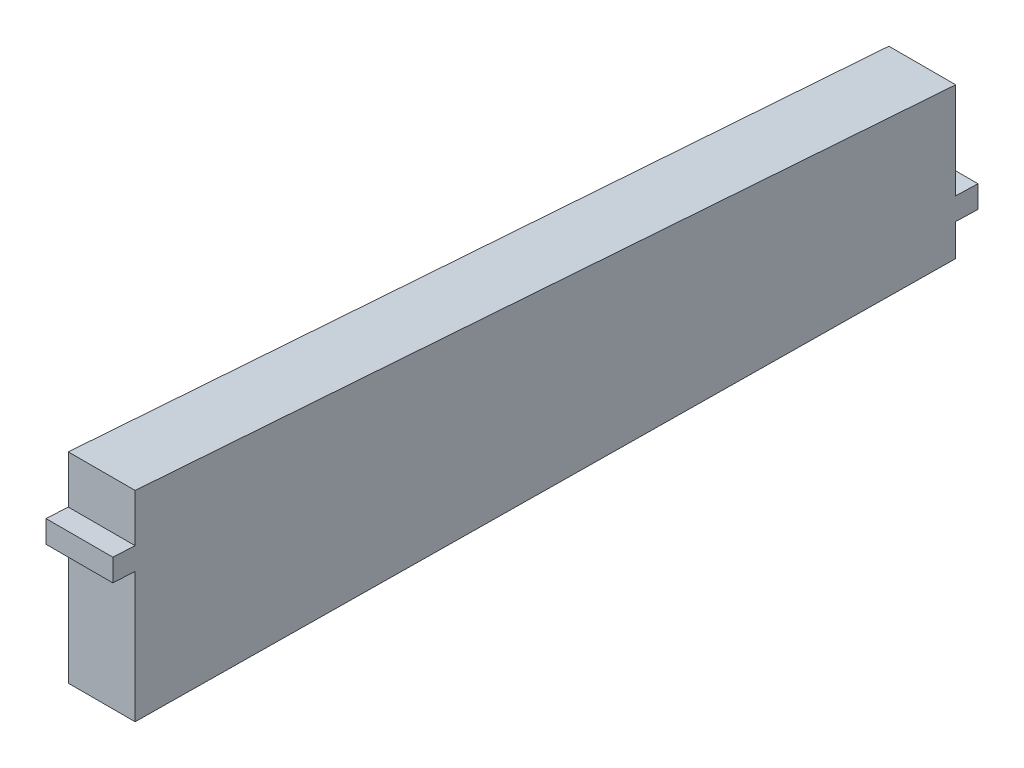
ISO-10303-21;
HEADER;
FILE_DESCRIPTION(('STEP AP214'),'2;1');
FILE_NAME('part.step','',(''),(''),'','','');
FILE_SCHEMA(('AUTOMOTIVE_DESIGN { 1 0 10303 214 1 1 1 1 }'));
ENDSEC;
DATA;
#1=APPLICATION_CONTEXT('core data for automotive mechanical design processes');
#2=APPLICATION_PROTOCOL_DEFINITION('international standard','automotive_design',2000,#1);
#3=PRODUCT_CONTEXT('',#1,'mechanical');
#4=PRODUCT('Part','Part','',(#3));
#5=PRODUCT_RELATED_PRODUCT_CATEGORY('part','',(#4));
#6=PRODUCT_DEFINITION_FORMATION('','',#4);
#7=PRODUCT_DEFINITION_CONTEXT('part definition',#1,'design');
#8=PRODUCT_DEFINITION('design','',#6,#7);
#9=PRODUCT_DEFINITION_SHAPE('','',#8);
#10=(LENGTH_UNIT() NAMED_UNIT(*) SI_UNIT(.MILLI.,.METRE.));
#11=(NAMED_UNIT(*) PLANE_ANGLE_UNIT() SI_UNIT($,.RADIAN.));
#12=(NAMED_UNIT(*) SI_UNIT($,.STERADIAN.) SOLID_ANGLE_UNIT());
#13=UNCERTAINTY_MEASURE_WITH_UNIT(LENGTH_MEASURE(1.E-05),#10,'distance_accuracy_value','');
#14=(GEOMETRIC_REPRESENTATION_CONTEXT(3) GLOBAL_UNCERTAINTY_ASSIGNED_CONTEXT((#13)) GLOBAL_UNIT_ASSIGNED_CONTEXT((#10,
#11,#12)) REPRESENTATION_CONTEXT('',''));
#15=CARTESIAN_POINT('',(0.,0.,0.));
#16=DIRECTION('',(0.,0.,1.));
#17=DIRECTION('',(1.,0.,0.));
#18=AXIS2_PLACEMENT_3D('',#15,#16,#17);
#19=CARTESIAN_POINT('',(243.017706630706,0.,0.));
#20=DIRECTION('',(1.,0.,0.));
#21=DIRECTION('',(0.,0.,1.));
#22=AXIS2_PLACEMENT_3D('',#19,#20,#21);
#23=PLANE('',#22);
#24=DIRECTION('',(0.,-0.0302886855911997,-0.999541192510423));
#25=VECTOR('',#24,1.);
#26=CARTESIAN_POINT('',(243.017706630706,362.929859581874,-1377.48536065991));
#27=LINE('',#26,#25);
#28=CARTESIAN_POINT('',(243.017706630706,362.929859581874,-1377.48536065991));
#29=VERTEX_POINT('',#28);
#30=CARTESIAN_POINT('',(243.017706630706,362.833648862923,-1380.66036065991));
#31=VERTEX_POINT('',#30);
#32=EDGE_CURVE('E128',#29,#31,#27,.T.);
#33=ORIENTED_EDGE('',*,*,#32,.T.);
#34=DIRECTION('',(0.,-1.,0.));
#35=VECTOR('',#34,1.);
#36=CARTESIAN_POINT('',(243.017706630706,362.833648862923,-1380.66036065991));
#37=LINE('',#36,#35);
#38=CARTESIAN_POINT('',(243.017706630706,359.658648862923,-1380.66036065991));
#39=VERTEX_POINT('',#38);
#40=EDGE_CURVE('E131',#31,#39,#37,.T.);
#41=ORIENTED_EDGE('',*,*,#40,.T.);
#42=DIRECTION('',(0.,0.0302886855911997,0.999541192510423));
#43=VECTOR('',#42,1.);
#44=CARTESIAN_POINT('',(243.017706630706,359.658648862923,-1380.66036065991));
#45=LINE('',#44,#43);
#46=CARTESIAN_POINT('',(243.017706630706,359.754859581874,-1377.48536065991));
#47=VERTEX_POINT('',#46);
#48=EDGE_CURVE('E136',#39,#47,#45,.T.);
#49=ORIENTED_EDGE('',*,*,#48,.T.);
#50=DIRECTION('',(0.,-1.,0.));
#51=VECTOR('',#50,1.);
#52=CARTESIAN_POINT('',(243.017706630706,355.176177259268,-1377.48536065991));
#53=LINE('',#52,#51);
#54=CARTESIAN_POINT('',(243.017706630706,355.176177259268,-1377.48536065991));
#55=VERTEX_POINT('',#54);
#56=EDGE_CURVE('E146',#47,#55,#53,.T.);
#57=ORIENTED_EDGE('',*,*,#56,.T.);
#58=DIRECTION('',(0.,0.0111918961884356,0.999937368768518));
#59=VECTOR('',#58,1.);
#60=CARTESIAN_POINT('',(243.017706630706,355.176177259268,-1377.48536065991));
#61=LINE('',#60,#59);
#62=CARTESIAN_POINT('',(243.017706630706,356.485104863458,-1260.53952749591));
#63=VERTEX_POINT('',#62);
#64=EDGE_CURVE('E149',#55,#63,#61,.T.);
#65=ORIENTED_EDGE('',*,*,#64,.T.);
#66=DIRECTION('',(0.,1.,0.));
#67=VECTOR('',#66,1.);
#68=CARTESIAN_POINT('',(243.017706630706,356.485104863458,-1260.53952749591));
#69=LINE('',#68,#67);
#70=CARTESIAN_POINT('',(243.017706630706,375.049679306953,-1260.53952749591));
#71=VERTEX_POINT('',#70);
#72=EDGE_CURVE('E152',#63,#71,#69,.T.);
#73=ORIENTED_EDGE('',*,*,#72,.T.);
#74=DIRECTION('',(0.,0.0527109798388512,0.998609809988079));
#75=VECTOR('',#74,1.);
#76=CARTESIAN_POINT('',(243.017706630706,375.049679306953,-1260.53952749591));
#77=LINE('',#76,#75);
#78=CARTESIAN_POINT('',(243.017706630706,375.217269650363,-1257.36452749591));
#79=VERTEX_POINT('',#78);
#80=EDGE_CURVE('E155',#71,#79,#77,.T.);
#81=ORIENTED_EDGE('',*,*,#80,.T.);
#82=DIRECTION('',(0.,1.,0.));
#83=VECTOR('',#82,1.);
#84=CARTESIAN_POINT('',(243.017706630706,375.217269650363,-1257.36452749591));
#85=LINE('',#84,#83);
#86=CARTESIAN_POINT('',(243.017706630706,378.392269650363,-1257.36452749591));
#87=VERTEX_POINT('',#86);
#88=EDGE_CURVE('E158',#79,#87,#85,.T.);
#89=ORIENTED_EDGE('',*,*,#88,.T.);
#90=DIRECTION('',(0.,-0.0527109798388338,-0.99860980998808));
#91=VECTOR('',#90,1.);
#92=CARTESIAN_POINT('',(243.017706630706,378.392269650363,-1257.36452749591));
#93=LINE('',#92,#91);
#94=CARTESIAN_POINT('',(243.017706630706,378.224679306953,-1260.53952749591));
#95=VERTEX_POINT('',#94);
#96=EDGE_CURVE('E161',#87,#95,#93,.T.);
#97=ORIENTED_EDGE('',*,*,#96,.T.);
#98=DIRECTION('',(0.,1.,0.));
#99=VECTOR('',#98,1.);
#100=CARTESIAN_POINT('',(243.017706630706,378.224679306953,-1260.53952749591));
#101=LINE('',#100,#99);
#102=CARTESIAN_POINT('',(243.017706630706,385.038195501593,-1260.53952749591));
#103=VERTEX_POINT('',#102);
#104=EDGE_CURVE('E164',#95,#103,#101,.T.);
#105=ORIENTED_EDGE('',*,*,#104,.T.);
#106=DIRECTION('',(0.,-0.0717092650954965,-0.997425576822383));
#107=VECTOR('',#106,1.);
#108=CARTESIAN_POINT('',(243.017706630706,385.038195501593,-1260.53952749591));
#109=LINE('',#108,#107);
#110=CARTESIAN_POINT('',(243.017706630706,376.630450656221,-1377.48536065991));
#111=VERTEX_POINT('',#110);
#112=EDGE_CURVE('E167',#103,#111,#109,.T.);
#113=ORIENTED_EDGE('',*,*,#112,.T.);
#114=DIRECTION('',(0.,-1.,0.));
#115=VECTOR('',#114,1.);
#116=CARTESIAN_POINT('',(243.017706630706,376.630450656221,-1377.48536065991));
#117=LINE('',#116,#115);
#118=EDGE_CURVE('E141',#111,#29,#117,.T.);
#119=ORIENTED_EDGE('',*,*,#118,.T.);
#120=EDGE_LOOP('',(#33,#41,#49,#57,#65,#73,#81,#89,#97,#105,#113,#119));
#121=FACE_BOUND('',#120,.T.);
#122=ADVANCED_FACE('F35',(#121),#23,.F.);
#123=CARTESIAN_POINT('',(379.40327027879,376.630450656221,-1377.48536065991));
#124=DIRECTION('',(0.,0.,1.));
#125=DIRECTION('',(-1.,0.,0.));
#126=AXIS2_PLACEMENT_3D('',#123,#124,#125);
#127=PLANE('',#126);
#128=DIRECTION('',(-1.,0.,0.));
#129=VECTOR('',#128,1.);
#130=CARTESIAN_POINT('',(379.40327027879,362.929859581874,-1377.48536065991));
#131=LINE('',#130,#129);
#132=CARTESIAN_POINT('',(252.542706630704,362.929859581874,-1377.48536065991));
#133=VERTEX_POINT('',#132);
#134=EDGE_CURVE('E170',#133,#29,#131,.T.);
#135=ORIENTED_EDGE('',*,*,#134,.T.);
#136=ORIENTED_EDGE('',*,*,#118,.F.);
#137=DIRECTION('',(-1.,0.,0.));
#138=VECTOR('',#137,1.);
#139=CARTESIAN_POINT('',(379.40327027879,376.630450656221,-1377.48536065991));
#140=LINE('',#139,#138);
#141=CARTESIAN_POINT('',(252.542706630704,376.630450656221,-1377.48536065991));
#142=VERTEX_POINT('',#141);
#143=EDGE_CURVE('E172',#142,#111,#140,.T.);
#144=ORIENTED_EDGE('',*,*,#143,.F.);
#145=DIRECTION('',(0.,1.,0.));
#146=VECTOR('',#145,1.);
#147=CARTESIAN_POINT('',(252.542706630704,376.630450656221,-1377.48536065991));
#148=LINE('',#147,#146);
#149=EDGE_CURVE('E39',#133,#142,#148,.T.);
#150=ORIENTED_EDGE('',*,*,#149,.F.);
#151=EDGE_LOOP('',(#135,#136,#144,#150));
#152=FACE_BOUND('',#151,.T.);
#153=ADVANCED_FACE('F239',(#152),#127,.F.);
#154=CARTESIAN_POINT('',(379.40327027879,385.038195501593,-1260.53952749591));
#155=DIRECTION('',(0.,-0.997425576822383,0.0717092650954965));
#156=DIRECTION('',(0.,0.0717092650954965,0.997425576822383));
#157=AXIS2_PLACEMENT_3D('',#154,#155,#156);
#158=PLANE('',#157);
#159=ORIENTED_EDGE('',*,*,#143,.T.);
#160=ORIENTED_EDGE('',*,*,#112,.F.);
#161=DIRECTION('',(-1.,0.,0.));
#162=VECTOR('',#161,1.);
#163=CARTESIAN_POINT('',(379.40327027879,385.038195501593,-1260.53952749591));
#164=LINE('',#163,#162);
#165=CARTESIAN_POINT('',(252.542706630704,385.038195501593,-1260.53952749591));
#166=VERTEX_POINT('',#165);
#167=EDGE_CURVE('E174',#166,#103,#164,.T.);
#168=ORIENTED_EDGE('',*,*,#167,.F.);
#169=DIRECTION('',(0.,0.0717092650954965,0.997425576822383));
#170=VECTOR('',#169,1.);
#171=CARTESIAN_POINT('',(252.542706630704,385.038195501593,-1260.53952749591));
#172=LINE('',#171,#170);
#173=EDGE_CURVE('E235',#142,#166,#172,.T.);
#174=ORIENTED_EDGE('',*,*,#173,.F.);
#175=EDGE_LOOP('',(#159,#160,#168,#174));
#176=FACE_BOUND('',#175,.T.);
#177=ADVANCED_FACE('F232',(#176),#158,.F.);
#178=CARTESIAN_POINT('',(379.40327027879,378.224679306953,-1260.53952749591));
#179=DIRECTION('',(0.,0.,-1.));
#180=DIRECTION('',(0.,-1.,0.));
#181=AXIS2_PLACEMENT_3D('',#178,#179,#180);
#182=PLANE('',#181);
#183=ORIENTED_EDGE('',*,*,#167,.T.);
#184=ORIENTED_EDGE('',*,*,#104,.F.);
#185=DIRECTION('',(-1.,0.,0.));
#186=VECTOR('',#185,1.);
#187=CARTESIAN_POINT('',(379.40327027879,378.224679306953,-1260.53952749591));
#188=LINE('',#187,#186);
#189=CARTESIAN_POINT('',(252.542706630704,378.224679306953,-1260.53952749591));
#190=VERTEX_POINT('',#189);
#191=EDGE_CURVE('E176',#190,#95,#188,.T.);
#192=ORIENTED_EDGE('',*,*,#191,.F.);
#193=DIRECTION('',(0.,-1.,0.));
#194=VECTOR('',#193,1.);
#195=CARTESIAN_POINT('',(252.542706630704,378.224679306953,-1260.53952749591));
#196=LINE('',#195,#194);
#197=EDGE_CURVE('E241',#166,#190,#196,.T.);
#198=ORIENTED_EDGE('',*,*,#197,.F.);
#199=EDGE_LOOP('',(#183,#184,#192,#198));
#200=FACE_BOUND('',#199,.T.);
#201=ADVANCED_FACE('F228',(#200),#182,.F.);
#202=CARTESIAN_POINT('',(379.40327027879,378.392269650363,-1257.36452749591));
#203=DIRECTION('',(0.,-0.99860980998808,0.0527109798388338));
#204=DIRECTION('',(0.,0.0527109798388338,0.998609809988081));
#205=AXIS2_PLACEMENT_3D('',#202,#203,#204);
#206=PLANE('',#205);
#207=ORIENTED_EDGE('',*,*,#191,.T.);
#208=ORIENTED_EDGE('',*,*,#96,.F.);
#209=DIRECTION('',(-1.,0.,0.));
#210=VECTOR('',#209,1.);
#211=CARTESIAN_POINT('',(379.40327027879,378.392269650363,-1257.36452749591));
#212=LINE('',#211,#210);
#213=CARTESIAN_POINT('',(252.542706630704,378.392269650363,-1257.36452749591));
#214=VERTEX_POINT('',#213);
#215=EDGE_CURVE('E178',#214,#87,#212,.T.);
#216=ORIENTED_EDGE('',*,*,#215,.F.);
#217=DIRECTION('',(0.,0.0527109798388338,0.99860980998808));
#218=VECTOR('',#217,1.);
#219=CARTESIAN_POINT('',(252.542706630704,378.392269650363,-1257.36452749591));
#220=LINE('',#219,#218);
#221=EDGE_CURVE('E225',#190,#214,#220,.T.);
#222=ORIENTED_EDGE('',*,*,#221,.F.);
#223=EDGE_LOOP('',(#207,#208,#216,#222));
#224=FACE_BOUND('',#223,.T.);
#225=ADVANCED_FACE('F222',(#224),#206,.F.);
#226=CARTESIAN_POINT('',(379.40327027879,375.217269650363,-1257.36452749591));
#227=DIRECTION('',(0.,0.,-1.));
#228=DIRECTION('',(1.,0.,0.));
#229=AXIS2_PLACEMENT_3D('',#226,#227,#228);
#230=PLANE('',#229);
#231=ORIENTED_EDGE('',*,*,#215,.T.);
#232=ORIENTED_EDGE('',*,*,#88,.F.);
#233=DIRECTION('',(-1.,0.,0.));
#234=VECTOR('',#233,1.);
#235=CARTESIAN_POINT('',(379.40327027879,375.217269650363,-1257.36452749591));
#236=LINE('',#235,#234);
#237=CARTESIAN_POINT('',(252.542706630704,375.217269650363,-1257.36452749591));
#238=VERTEX_POINT('',#237);
#239=EDGE_CURVE('E180',#238,#79,#236,.T.);
#240=ORIENTED_EDGE('',*,*,#239,.F.);
#241=DIRECTION('',(0.,-1.,0.));
#242=VECTOR('',#241,1.);
#243=CARTESIAN_POINT('',(252.542706630704,375.217269650363,-1257.36452749591));
#244=LINE('',#243,#242);
#245=EDGE_CURVE('E219',#214,#238,#244,.T.);
#246=ORIENTED_EDGE('',*,*,#245,.F.);
#247=EDGE_LOOP('',(#231,#232,#240,#246));
#248=FACE_BOUND('',#247,.T.);
#249=ADVANCED_FACE('F216',(#248),#230,.F.);
#250=CARTESIAN_POINT('',(379.40327027879,375.049679306953,-1260.53952749591));
#251=DIRECTION('',(0.,0.99860980998808,-0.0527109798388512));
#252=DIRECTION('',(0.,-0.0527109798388512,-0.99860980998808));
#253=AXIS2_PLACEMENT_3D('',#250,#251,#252);
#254=PLANE('',#253);
#255=ORIENTED_EDGE('',*,*,#239,.T.);
#256=ORIENTED_EDGE('',*,*,#80,.F.);
#257=DIRECTION('',(-1.,0.,0.));
#258=VECTOR('',#257,1.);
#259=CARTESIAN_POINT('',(379.40327027879,375.049679306953,-1260.53952749591));
#260=LINE('',#259,#258);
#261=CARTESIAN_POINT('',(252.542706630704,375.049679306953,-1260.53952749591));
#262=VERTEX_POINT('',#261);
#263=EDGE_CURVE('E182',#262,#71,#260,.T.);
#264=ORIENTED_EDGE('',*,*,#263,.F.);
#265=DIRECTION('',(0.,-0.0527109798388512,-0.99860980998808));
#266=VECTOR('',#265,1.);
#267=CARTESIAN_POINT('',(252.542706630704,375.049679306953,-1260.53952749591));
#268=LINE('',#267,#266);
#269=EDGE_CURVE('E247',#238,#262,#268,.T.);
#270=ORIENTED_EDGE('',*,*,#269,.F.);
#271=EDGE_LOOP('',(#255,#256,#264,#270));
#272=FACE_BOUND('',#271,.T.);
#273=ADVANCED_FACE('F211',(#272),#254,.F.);
#274=CARTESIAN_POINT('',(379.40327027879,356.485104863458,-1260.53952749591));
#275=DIRECTION('',(0.,0.,-1.));
#276=DIRECTION('',(0.,-1.,0.));
#277=AXIS2_PLACEMENT_3D('',#274,#275,#276);
#278=PLANE('',#277);
#279=ORIENTED_EDGE('',*,*,#263,.T.);
#280=ORIENTED_EDGE('',*,*,#72,.F.);
#281=DIRECTION('',(-1.,0.,0.));
#282=VECTOR('',#281,1.);
#283=CARTESIAN_POINT('',(379.40327027879,356.485104863458,-1260.53952749591));
#284=LINE('',#283,#282);
#285=CARTESIAN_POINT('',(252.542706630704,356.485104863458,-1260.53952749591));
#286=VERTEX_POINT('',#285);
#287=EDGE_CURVE('E184',#286,#63,#284,.T.);
#288=ORIENTED_EDGE('',*,*,#287,.F.);
#289=DIRECTION('',(0.,-1.,0.));
#290=VECTOR('',#289,1.);
#291=CARTESIAN_POINT('',(252.542706630704,356.485104863458,-1260.53952749591));
#292=LINE('',#291,#290);
#293=EDGE_CURVE('E208',#262,#286,#292,.T.);
#294=ORIENTED_EDGE('',*,*,#293,.F.);
#295=EDGE_LOOP('',(#279,#280,#288,#294));
#296=FACE_BOUND('',#295,.T.);
#297=ADVANCED_FACE('F205',(#296),#278,.F.);
#298=CARTESIAN_POINT('',(379.40327027879,355.176177259268,-1377.48536065991));
#299=DIRECTION('',(0.,0.999937368768518,-0.0111918961884356));
#300=DIRECTION('',(0.,-0.0111918961884356,-0.999937368768518));
#301=AXIS2_PLACEMENT_3D('',#298,#299,#300);
#302=PLANE('',#301);
#303=ORIENTED_EDGE('',*,*,#287,.T.);
#304=ORIENTED_EDGE('',*,*,#64,.F.);
#305=DIRECTION('',(-1.,0.,0.));
#306=VECTOR('',#305,1.);
#307=CARTESIAN_POINT('',(379.40327027879,355.176177259268,-1377.48536065991));
#308=LINE('',#307,#306);
#309=CARTESIAN_POINT('',(252.542706630704,355.176177259268,-1377.48536065991));
#310=VERTEX_POINT('',#309);
#311=EDGE_CURVE('E186',#310,#55,#308,.T.);
#312=ORIENTED_EDGE('',*,*,#311,.F.);
#313=DIRECTION('',(0.,-0.0111918961884356,-0.999937368768518));
#314=VECTOR('',#313,1.);
#315=CARTESIAN_POINT('',(252.542706630704,355.176177259268,-1377.48536065991));
#316=LINE('',#315,#314);
#317=EDGE_CURVE('E202',#286,#310,#316,.T.);
#318=ORIENTED_EDGE('',*,*,#317,.F.);
#319=EDGE_LOOP('',(#303,#304,#312,#318));
#320=FACE_BOUND('',#319,.T.);
#321=ADVANCED_FACE('F199',(#320),#302,.F.);
#322=CARTESIAN_POINT('',(379.40327027879,355.176177259268,-1377.48536065991));
#323=DIRECTION('',(0.,0.,1.));
#324=DIRECTION('',(-1.,0.,0.));
#325=AXIS2_PLACEMENT_3D('',#322,#323,#324);
#326=PLANE('',#325);
#327=ORIENTED_EDGE('',*,*,#311,.T.);
#328=ORIENTED_EDGE('',*,*,#56,.F.);
#329=DIRECTION('',(-1.,0.,0.));
#330=VECTOR('',#329,1.);
#331=CARTESIAN_POINT('',(379.40327027879,359.754859581874,-1377.48536065991));
#332=LINE('',#331,#330);
#333=CARTESIAN_POINT('',(252.542706630704,359.754859581874,-1377.48536065991));
#334=VERTEX_POINT('',#333);
#335=EDGE_CURVE('E188',#334,#47,#332,.T.);
#336=ORIENTED_EDGE('',*,*,#335,.F.);
#337=DIRECTION('',(0.,1.,0.));
#338=VECTOR('',#337,1.);
#339=CARTESIAN_POINT('',(252.542706630704,355.176177259268,-1377.48536065991));
#340=LINE('',#339,#338);
#341=EDGE_CURVE('E251',#310,#334,#340,.T.);
#342=ORIENTED_EDGE('',*,*,#341,.F.);
#343=EDGE_LOOP('',(#327,#328,#336,#342));
#344=FACE_BOUND('',#343,.T.);
#345=ADVANCED_FACE('F194',(#344),#326,.F.);
#346=CARTESIAN_POINT('',(379.40327027879,359.658648862923,-1380.66036065991));
#347=DIRECTION('',(0.,0.999541192510422,-0.0302886855911997));
#348=DIRECTION('',(0.,-0.0302886855911997,-0.999541192510423));
#349=AXIS2_PLACEMENT_3D('',#346,#347,#348);
#350=PLANE('',#349);
#351=ORIENTED_EDGE('',*,*,#335,.T.);
#352=ORIENTED_EDGE('',*,*,#48,.F.);
#353=DIRECTION('',(-1.,0.,0.));
#354=VECTOR('',#353,1.);
#355=CARTESIAN_POINT('',(379.40327027879,359.658648862923,-1380.66036065991));
#356=LINE('',#355,#354);
#357=CARTESIAN_POINT('',(252.542706630704,359.658648862923,-1380.66036065991));
#358=VERTEX_POINT('',#357);
#359=EDGE_CURVE('E129',#358,#39,#356,.T.);
#360=ORIENTED_EDGE('',*,*,#359,.F.);
#361=DIRECTION('',(0.,-0.0302886855911997,-0.999541192510423));
#362=VECTOR('',#361,1.);
#363=CARTESIAN_POINT('',(252.542706630704,359.658648862923,-1380.66036065991));
#364=LINE('',#363,#362);
#365=EDGE_CURVE('E58',#334,#358,#364,.T.);
#366=ORIENTED_EDGE('',*,*,#365,.F.);
#367=EDGE_LOOP('',(#351,#352,#360,#366));
#368=FACE_BOUND('',#367,.T.);
#369=ADVANCED_FACE('F192',(#368),#350,.F.);
#370=CARTESIAN_POINT('',(379.40327027879,362.833648862923,-1380.66036065991));
#371=DIRECTION('',(0.,0.,1.));
#372=DIRECTION('',(-1.,0.,0.));
#373=AXIS2_PLACEMENT_3D('',#370,#371,#372);
#374=PLANE('',#373);
#375=ORIENTED_EDGE('',*,*,#359,.T.);
#376=ORIENTED_EDGE('',*,*,#40,.F.);
#377=DIRECTION('',(-1.,0.,0.));
#378=VECTOR('',#377,1.);
#379=CARTESIAN_POINT('',(379.40327027879,362.833648862923,-1380.66036065991));
#380=LINE('',#379,#378);
#381=CARTESIAN_POINT('',(252.542706630704,362.833648862923,-1380.66036065991));
#382=VERTEX_POINT('',#381);
#383=EDGE_CURVE('E124',#382,#31,#380,.T.);
#384=ORIENTED_EDGE('',*,*,#383,.F.);
#385=DIRECTION('',(0.,1.,0.));
#386=VECTOR('',#385,1.);
#387=CARTESIAN_POINT('',(252.542706630704,362.833648862923,-1380.66036065991));
#388=LINE('',#387,#386);
#389=EDGE_CURVE('E44',#358,#382,#388,.T.);
#390=ORIENTED_EDGE('',*,*,#389,.F.);
#391=EDGE_LOOP('',(#375,#376,#384,#390));
#392=FACE_BOUND('',#391,.T.);
#393=ADVANCED_FACE('F132',(#392),#374,.F.);
#394=CARTESIAN_POINT('',(379.40327027879,362.929859581874,-1377.48536065991));
#395=DIRECTION('',(0.,-0.999541192510422,0.0302886855911997));
#396=DIRECTION('',(0.,0.0302886855911997,0.999541192510423));
#397=AXIS2_PLACEMENT_3D('',#394,#395,#396);
#398=PLANE('',#397);
#399=ORIENTED_EDGE('',*,*,#383,.T.);
#400=ORIENTED_EDGE('',*,*,#32,.F.);
#401=ORIENTED_EDGE('',*,*,#134,.F.);
#402=DIRECTION('',(0.,0.0302886855911997,0.999541192510423));
#403=VECTOR('',#402,1.);
#404=CARTESIAN_POINT('',(252.542706630704,362.929859581874,-1377.48536065991));
#405=LINE('',#404,#403);
#406=EDGE_CURVE('E11',#382,#133,#405,.T.);
#407=ORIENTED_EDGE('',*,*,#406,.F.);
#408=EDGE_LOOP('',(#399,#400,#401,#407));
#409=FACE_BOUND('',#408,.T.);
#410=ADVANCED_FACE('F37',(#409),#398,.F.);
#411=CARTESIAN_POINT('',(252.542706630704,344.834338896103,-776.88119407791));
#412=DIRECTION('',(-1.,0.,0.));
#413=DIRECTION('',(0.,0.,-1.));
#414=AXIS2_PLACEMENT_3D('',#411,#412,#413);
#415=PLANE('',#414);
#416=ORIENTED_EDGE('',*,*,#389,.T.);
#417=ORIENTED_EDGE('',*,*,#406,.T.);
#418=ORIENTED_EDGE('',*,*,#149,.T.);
#419=ORIENTED_EDGE('',*,*,#173,.T.);
#420=ORIENTED_EDGE('',*,*,#197,.T.);
#421=ORIENTED_EDGE('',*,*,#221,.T.);
#422=ORIENTED_EDGE('',*,*,#245,.T.);
#423=ORIENTED_EDGE('',*,*,#269,.T.);
#424=ORIENTED_EDGE('',*,*,#293,.T.);
#425=ORIENTED_EDGE('',*,*,#317,.T.);
#426=ORIENTED_EDGE('',*,*,#341,.T.);
#427=ORIENTED_EDGE('',*,*,#365,.T.);
#428=EDGE_LOOP('',(#416,#417,#418,#419,#420,#421,#422,#423,#424,#425,#426,#427));
#429=FACE_BOUND('',#428,.T.);
#430=ADVANCED_FACE('F253',(#429),#415,.F.);
#431=CLOSED_SHELL('',(#122,#153,#177,#201,#225,#249,#273,#297,#321,#345,#369,#393,#410,#430));
#432=MANIFOLD_SOLID_BREP('B2',#431);
#433=ADVANCED_BREP_SHAPE_REPRESENTATION('',(#18,#432),#14);
#434=SHAPE_DEFINITION_REPRESENTATION(#9,#433);
ENDSEC;
END-ISO-10303-21;
